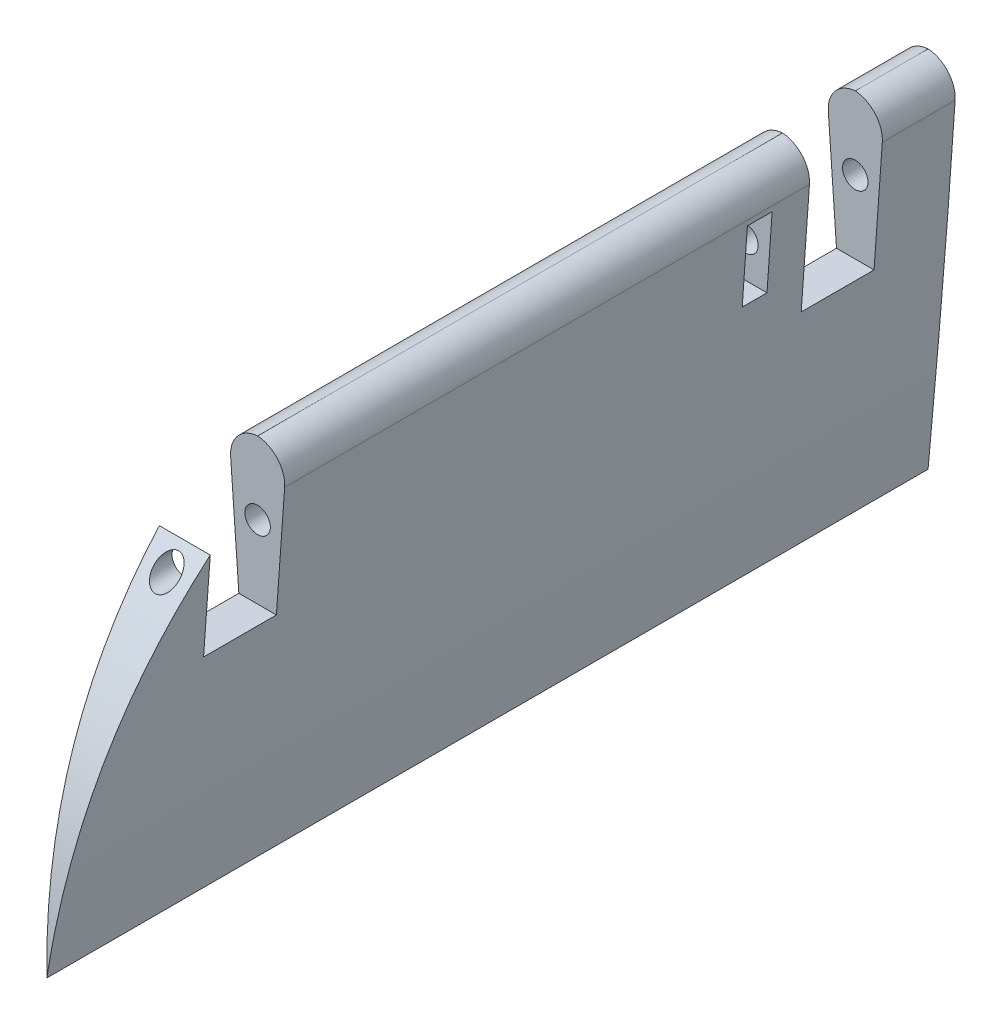
ISO-10303-21;
HEADER;
FILE_DESCRIPTION(('STEP AP214'),'2;1');
FILE_NAME('part.step','',(''),(''),'','','');
FILE_SCHEMA(('AUTOMOTIVE_DESIGN { 1 0 10303 214 1 1 1 1 }'));
ENDSEC;
DATA;
#1=APPLICATION_CONTEXT('core data for automotive mechanical design processes');
#2=APPLICATION_PROTOCOL_DEFINITION('international standard','automotive_design',2000,#1);
#3=PRODUCT_CONTEXT('',#1,'mechanical');
#4=PRODUCT('Part','Part','',(#3));
#5=PRODUCT_RELATED_PRODUCT_CATEGORY('part','',(#4));
#6=PRODUCT_DEFINITION_FORMATION('','',#4);
#7=PRODUCT_DEFINITION_CONTEXT('part definition',#1,'design');
#8=PRODUCT_DEFINITION('design','',#6,#7);
#9=PRODUCT_DEFINITION_SHAPE('','',#8);
#10=(LENGTH_UNIT() NAMED_UNIT(*) SI_UNIT(.MILLI.,.METRE.));
#11=(NAMED_UNIT(*) PLANE_ANGLE_UNIT() SI_UNIT($,.RADIAN.));
#12=(NAMED_UNIT(*) SI_UNIT($,.STERADIAN.) SOLID_ANGLE_UNIT());
#13=UNCERTAINTY_MEASURE_WITH_UNIT(LENGTH_MEASURE(1.E-05),#10,'distance_accuracy_value','');
#14=(GEOMETRIC_REPRESENTATION_CONTEXT(3) GLOBAL_UNCERTAINTY_ASSIGNED_CONTEXT((#13)) GLOBAL_UNIT_ASSIGNED_CONTEXT((#10,
#11,#12)) REPRESENTATION_CONTEXT('',''));
#15=CARTESIAN_POINT('',(0.,0.,0.));
#16=DIRECTION('',(0.,0.,1.));
#17=DIRECTION('',(1.,0.,0.));
#18=AXIS2_PLACEMENT_3D('',#15,#16,#17);
#19=CARTESIAN_POINT('',(0.,-55.,137.120066952089));
#20=DIRECTION('',(0.,0.,-1.));
#21=DIRECTION('',(0.,1.,0.));
#22=AXIS2_PLACEMENT_3D('',#19,#20,#21);
#23=CYLINDRICAL_SURFACE('',#22,1.75);
#24=CARTESIAN_POINT('',(0.,-55.,40.48));
#25=DIRECTION('',(0.,0.,1.));
#26=DIRECTION('',(1.,0.,0.));
#27=AXIS2_PLACEMENT_3D('',#24,#25,#26);
#28=CIRCLE('',#27,1.75);
#29=CARTESIAN_POINT('',(1.75,-55.,40.48));
#30=VERTEX_POINT('',#29);
#31=EDGE_CURVE('E176',#30,#30,#28,.F.);
#32=ORIENTED_EDGE('',*,*,#31,.T.);
#33=EDGE_LOOP('',(#32));
#34=FACE_BOUND('',#33,.T.);
#35=CARTESIAN_POINT('',(0.,-55.,104.062447801836));
#36=DIRECTION('',(0.,0.,-1.));
#37=DIRECTION('',(-1.,0.,0.));
#38=AXIS2_PLACEMENT_3D('',#35,#36,#37);
#39=CIRCLE('',#38,1.75);
#40=CARTESIAN_POINT('',(-1.75,-55.,104.062447801836));
#41=VERTEX_POINT('',#40);
#42=EDGE_CURVE('E245',#41,#41,#39,.F.);
#43=ORIENTED_EDGE('',*,*,#42,.T.);
#44=EDGE_LOOP('',(#43));
#45=FACE_BOUND('',#44,.T.);
#46=ADVANCED_FACE('F38',(#34,#45),#23,.F.);
#47=CARTESIAN_POINT('',(0.,-55.,22.));
#48=DIRECTION('',(0.,0.,-1.));
#49=DIRECTION('',(0.,1.,0.));
#50=AXIS2_PLACEMENT_3D('',#47,#48,#49);
#51=CIRCLE('',#50,1.75);
#52=CARTESIAN_POINT('',(0.,-53.25,22.));
#53=VERTEX_POINT('',#52);
#54=EDGE_CURVE('E295',#53,#53,#51,.F.);
#55=ORIENTED_EDGE('',*,*,#54,.T.);
#56=EDGE_LOOP('',(#55));
#57=FACE_BOUND('',#56,.T.);
#58=CARTESIAN_POINT('',(0.,-55.,12.));
#59=DIRECTION('',(0.,0.,-1.));
#60=DIRECTION('',(0.,1.,0.));
#61=AXIS2_PLACEMENT_3D('',#58,#59,#60);
#62=CIRCLE('',#61,1.75);
#63=CARTESIAN_POINT('',(0.,-53.25,12.));
#64=VERTEX_POINT('',#63);
#65=EDGE_CURVE('E334',#64,#64,#62,.T.);
#66=ORIENTED_EDGE('',*,*,#65,.T.);
#67=EDGE_LOOP('',(#66));
#68=FACE_BOUND('',#67,.T.);
#69=ADVANCED_FACE('F435',(#57,#68),#23,.F.);
#70=CARTESIAN_POINT('',(-0.275771927554584,-49.,58.5240684410084));
#71=DIRECTION('',(0.,0.,-1.));
#72=DIRECTION('',(-1.,0.,0.));
#73=AXIS2_PLACEMENT_3D('',#70,#71,#72);
#74=CYLINDRICAL_SURFACE('',#73,4.);
#75=CARTESIAN_POINT('',(-0.275771927554584,-49.,22.));
#76=DIRECTION('',(0.,0.,-1.));
#77=DIRECTION('',(0.,1.,0.));
#78=AXIS2_PLACEMENT_3D('',#75,#76,#77);
#79=CIRCLE('',#78,4.);
#80=CARTESIAN_POINT('',(3.71553164111286,-49.2636206037898,22.));
#81=VERTEX_POINT('',#80);
#82=CARTESIAN_POINT('',(0.00661221316332859,-45.00998005054,22.));
#83=VERTEX_POINT('',#82);
#84=EDGE_CURVE('E277',#81,#83,#79,.F.);
#85=ORIENTED_EDGE('',*,*,#84,.F.);
#86=DIRECTION('',(0.,0.,-1.));
#87=VECTOR('',#86,1.);
#88=CARTESIAN_POINT('',(3.71553164111332,-49.2636206037829,12.));
#89=LINE('',#88,#87);
#90=CARTESIAN_POINT('',(3.71553164111332,-49.2636206037829,12.));
#91=VERTEX_POINT('',#90);
#92=EDGE_CURVE('E480',#91,#81,#89,.F.);
#93=ORIENTED_EDGE('',*,*,#92,.F.);
#94=CARTESIAN_POINT('',(-0.275771927554584,-49.,12.));
#95=DIRECTION('',(0.,0.,1.));
#96=DIRECTION('',(0.,-1.,0.));
#97=AXIS2_PLACEMENT_3D('',#94,#95,#96);
#98=CIRCLE('',#97,4.);
#99=CARTESIAN_POINT('',(0.00661221314729004,-45.0099800505411,12.));
#100=VERTEX_POINT('',#99);
#101=EDGE_CURVE('E490',#100,#91,#98,.F.);
#102=ORIENTED_EDGE('',*,*,#101,.F.);
#103=DIRECTION('',(0.,0.,-1.));
#104=VECTOR('',#103,1.);
#105=CARTESIAN_POINT('',(0.00661221314729021,-45.0099800505411,61.5915419333976));
#106=LINE('',#105,#104);
#107=EDGE_CURVE('E333',#83,#100,#106,.T.);
#108=ORIENTED_EDGE('',*,*,#107,.F.);
#109=EDGE_LOOP('',(#85,#93,#102,#108));
#110=FACE_BOUND('',#109,.T.);
#111=ADVANCED_FACE('F443',(#110),#74,.T.);
#112=CARTESIAN_POINT('',(0.288996353849457,-49.,58.5240684410084));
#113=DIRECTION('',(0.,0.,-1.));
#114=DIRECTION('',(-1.,0.,0.));
#115=AXIS2_PLACEMENT_3D('',#112,#113,#114);
#116=CYLINDRICAL_SURFACE('',#115,4.);
#117=CARTESIAN_POINT('',(0.288996353849457,-49.,22.));
#118=DIRECTION('',(0.,0.,-1.));
#119=DIRECTION('',(0.,1.,0.));
#120=AXIS2_PLACEMENT_3D('',#117,#118,#119);
#121=CIRCLE('',#120,4.);
#122=CARTESIAN_POINT('',(-3.70247815419465,-49.2610196384069,22.));
#123=VERTEX_POINT('',#122);
#124=EDGE_CURVE('E468',#83,#123,#121,.F.);
#125=ORIENTED_EDGE('',*,*,#124,.F.);
#126=ORIENTED_EDGE('',*,*,#107,.T.);
#127=CARTESIAN_POINT('',(0.288996353849457,-49.,12.));
#128=DIRECTION('',(0.,0.,1.));
#129=DIRECTION('',(0.,-1.,0.));
#130=AXIS2_PLACEMENT_3D('',#127,#128,#129);
#131=CIRCLE('',#130,4.);
#132=CARTESIAN_POINT('',(-3.70247815419465,-49.2610196384069,12.));
#133=VERTEX_POINT('',#132);
#134=EDGE_CURVE('E487',#133,#100,#131,.F.);
#135=ORIENTED_EDGE('',*,*,#134,.F.);
#136=DIRECTION('',(0.,0.,-1.));
#137=VECTOR('',#136,1.);
#138=CARTESIAN_POINT('',(-3.70247815419465,-49.2610196384069,110.588472299358));
#139=LINE('',#138,#137);
#140=EDGE_CURVE('E387',#123,#133,#139,.T.);
#141=ORIENTED_EDGE('',*,*,#140,.F.);
#142=EDGE_LOOP('',(#125,#126,#135,#141));
#143=FACE_BOUND('',#142,.T.);
#144=ADVANCED_FACE('F530',(#143),#116,.T.);
#145=CARTESIAN_POINT('',(-4.88526119402984,10.,150.));
#146=CARTESIAN_POINT('',(-7.,-20.,150.));
#147=CARTESIAN_POINT('',(0.,-95.,150.));
#148=B_SPLINE_CURVE_WITH_KNOTS('',2,(#145,#146,#147),.UNSPECIFIED.,.F.,.F.,(3,3),(0.,1.),.UNSPECIFIED.);
#149=DIRECTION('',(0.,0.,-1.));
#150=VECTOR('',#149,1.);
#151=SURFACE_OF_LINEAR_EXTRUSION('',#148,#150);
#152=DIRECTION('',(0.,0.,-1.));
#153=VECTOR('',#152,1.);
#154=CARTESIAN_POINT('',(-3.65391791044813,-49.9999999999943,72.863));
#155=LINE('',#154,#153);
#156=CARTESIAN_POINT('',(-3.65391791044783,-50.,37.08));
#157=VERTEX_POINT('',#156);
#158=CARTESIAN_POINT('',(-3.65391791044813,-50.,40.48));
#159=VERTEX_POINT('',#158);
#160=EDGE_CURVE('E152',#157,#159,#155,.F.);
#161=ORIENTED_EDGE('',*,*,#160,.T.);
#162=CARTESIAN_POINT('',(-4.88526119402984,10.,40.48));
#163=CARTESIAN_POINT('',(-7.,-20.,40.48));
#164=CARTESIAN_POINT('',(0.,-95.,40.48));
#165=B_SPLINE_CURVE_WITH_KNOTS('',2,(#162,#163,#164),.UNSPECIFIED.,.F.,.F.,(3,3),(0.,1.),.UNSPECIFIED.);
#166=CARTESIAN_POINT('',(-2.95343773233485,-60.,40.48));
#167=VERTEX_POINT('',#166);
#168=EDGE_CURVE('E199',#159,#167,#165,.T.);
#169=ORIENTED_EDGE('',*,*,#168,.T.);
#170=DIRECTION('',(0.,0.,-1.));
#171=VECTOR('',#170,1.);
#172=CARTESIAN_POINT('',(-2.95343773233485,-60.,72.863));
#173=LINE('',#172,#171);
#174=CARTESIAN_POINT('',(-2.95343773233485,-60.,37.08));
#175=VERTEX_POINT('',#174);
#176=EDGE_CURVE('E163',#167,#175,#173,.T.);
#177=ORIENTED_EDGE('',*,*,#176,.T.);
#178=CARTESIAN_POINT('',(-4.88526119402984,10.,37.08));
#179=CARTESIAN_POINT('',(-7.,-20.,37.08));
#180=CARTESIAN_POINT('',(0.,-95.,37.08));
#181=B_SPLINE_CURVE_WITH_KNOTS('',2,(#178,#179,#180),.UNSPECIFIED.,.F.,.F.,(3,3),(0.,1.),.UNSPECIFIED.);
#182=EDGE_CURVE('E167',#175,#157,#181,.F.);
#183=ORIENTED_EDGE('',*,*,#182,.T.);
#184=EDGE_LOOP('',(#161,#169,#177,#183));
#185=FACE_BOUND('',#184,.T.);
#186=DIRECTION('',(0.,0.,-1.));
#187=VECTOR('',#186,1.);
#188=CARTESIAN_POINT('',(-2.5747833014378,-65.00998005054,72.863));
#189=LINE('',#188,#187);
#190=CARTESIAN_POINT('',(-2.57478330195571,-65.00998005054,32.));
#191=VERTEX_POINT('',#190);
#192=CARTESIAN_POINT('',(-2.5747833014378,-65.00998005054,22.));
#193=VERTEX_POINT('',#192);
#194=EDGE_CURVE('E329',#191,#193,#189,.T.);
#195=ORIENTED_EDGE('',*,*,#194,.T.);
#196=CARTESIAN_POINT('',(-4.88526119402984,10.,22.));
#197=CARTESIAN_POINT('',(-7.,-20.,22.));
#198=CARTESIAN_POINT('',(0.,-95.,22.));
#199=B_SPLINE_CURVE_WITH_KNOTS('',2,(#196,#197,#198),.UNSPECIFIED.,.F.,.F.,(3,3),(0.,1.),.UNSPECIFIED.);
#200=EDGE_CURVE('E286',#193,#123,#199,.F.);
#201=ORIENTED_EDGE('',*,*,#200,.T.);
#202=ORIENTED_EDGE('',*,*,#140,.T.);
#203=CARTESIAN_POINT('',(-4.88526119402984,10.,12.));
#204=CARTESIAN_POINT('',(-7.,-20.,12.));
#205=CARTESIAN_POINT('',(0.,-95.,12.));
#206=B_SPLINE_CURVE_WITH_KNOTS('',2,(#203,#204,#205),.UNSPECIFIED.,.F.,.F.,(3,3),(0.,1.),.UNSPECIFIED.);
#207=CARTESIAN_POINT('',(0.,-95.,12.));
#208=VERTEX_POINT('',#207);
#209=EDGE_CURVE('E511',#133,#208,#206,.T.);
#210=ORIENTED_EDGE('',*,*,#209,.T.);
#211=DIRECTION('',(0.,0.,-1.));
#212=VECTOR('',#211,1.);
#213=CARTESIAN_POINT('',(0.,-95.,150.));
#214=LINE('',#213,#212);
#215=CARTESIAN_POINT('',(0.,-95.,133.));
#216=VERTEX_POINT('',#215);
#217=EDGE_CURVE('E507',#216,#208,#214,.T.);
#218=ORIENTED_EDGE('',*,*,#217,.F.);
#219=CARTESIAN_POINT('',(0.,-95.,133.));
#220=CARTESIAN_POINT('',(-0.0584034225727897,-94.3742508216102,132.953702938274));
#221=CARTESIAN_POINT('',(-0.11650636714418,-93.7489683881835,132.900558011341));
#222=CARTESIAN_POINT('',(-0.232083168674797,-92.4995503925808,132.780112658013));
#223=CARTESIAN_POINT('',(-0.289556862241481,-91.8754151617299,132.712808642646));
#224=CARTESIAN_POINT('',(-0.403823044874967,-90.6287607321233,132.563600944772));
#225=CARTESIAN_POINT('',(-0.460615465385538,-90.0062417008629,132.481695805897));
#226=CARTESIAN_POINT('',(-0.573467899404635,-88.7632962282029,132.302856395714));
#227=CARTESIAN_POINT('',(-0.629527913037087,-88.1428697864494,132.20592212695));
#228=CARTESIAN_POINT('',(-0.741026182077854,-86.9028011283669,131.996308126714));
#229=CARTESIAN_POINT('',(-0.796462228293532,-86.2831661032472,131.883584601598));
#230=CARTESIAN_POINT('',(-0.906499459238202,-85.046953679061,131.642202189913));
#231=CARTESIAN_POINT('',(-0.961100674792454,-84.4303761676697,131.513543893322));
#232=CARTESIAN_POINT('',(-1.06942212321582,-83.2007475005484,131.239905905399));
#233=CARTESIAN_POINT('',(-1.12314232673307,-82.5876964627468,131.094925671544));
#234=CARTESIAN_POINT('',(-1.22965658923413,-81.3655980783779,130.78828125882));
#235=CARTESIAN_POINT('',(-1.28245049647298,-80.7565513978325,130.626614375673));
#236=CARTESIAN_POINT('',(-1.40822163555258,-79.2975538010185,130.217431902014));
#237=CARTESIAN_POINT('',(-1.48072019962185,-78.4498616983703,129.961651804522));
#238=CARTESIAN_POINT('',(-1.62364280767818,-76.7652001799127,129.415840467806));
#239=CARTESIAN_POINT('',(-1.69406641050507,-75.928233065429,129.125802009593));
#240=CARTESIAN_POINT('',(-1.83268935460771,-74.2668880828053,128.511013764779));
#241=CARTESIAN_POINT('',(-1.90088857394494,-73.4425109061463,128.186262079392));
#242=CARTESIAN_POINT('',(-2.03492863577877,-71.8081564756131,127.501811111396));
#243=CARTESIAN_POINT('',(-2.10076940221848,-70.9981796865554,127.142110703124));
#244=CARTESIAN_POINT('',(-2.22991563882229,-69.3951085048869,126.388115492584));
#245=CARTESIAN_POINT('',(-2.29322318700014,-68.6020005357309,125.993849928251));
#246=CARTESIAN_POINT('',(-2.41725735906117,-67.0336865796972,125.170768122033));
#247=CARTESIAN_POINT('',(-2.47798393235979,-66.2584809438235,124.741951203453));
#248=CARTESIAN_POINT('',(-2.59676392682587,-64.7276882950721,123.850401630293));
#249=CARTESIAN_POINT('',(-2.65481753754761,-63.9720998926924,123.387671386741));
#250=CARTESIAN_POINT('',(-2.76818393879278,-62.4820888557689,122.429197321561));
#251=CARTESIAN_POINT('',(-2.82349710924275,-61.7476632932117,121.933458098663));
#252=CARTESIAN_POINT('',(-2.9239639051309,-60.4002620089743,120.980124963114));
#253=CARTESIAN_POINT('',(-2.9694715872808,-59.7844261523127,120.526602396967));
#254=CARTESIAN_POINT('',(-3.05841272929596,-58.5701231375662,119.596588867895));
#255=CARTESIAN_POINT('',(-3.10184604552841,-57.971657183327,119.120096319066));
#256=CARTESIAN_POINT('',(-3.1866445182611,-56.7926434017922,118.145040837321));
#257=CARTESIAN_POINT('',(-3.22800926841692,-56.2120991034908,117.646473604087));
#258=CARTESIAN_POINT('',(-3.30868731034548,-55.0693804442162,116.628263626139));
#259=CARTESIAN_POINT('',(-3.34800005560911,-54.507210991755,116.10861533175));
#260=CARTESIAN_POINT('',(-3.42459948984835,-53.4016130302037,115.049337275581));
#261=CARTESIAN_POINT('',(-3.46188565432027,-52.8581893859255,114.509702401222));
#262=CARTESIAN_POINT('',(-3.53467289863078,-51.7873206696567,113.408498054647));
#263=CARTESIAN_POINT('',(-3.57016220636822,-51.2599882059896,112.84681835812));
#264=CARTESIAN_POINT('',(-3.63916661543019,-50.2247921782294,111.705745479416));
#265=CARTESIAN_POINT('',(-3.67268182222155,-49.7169275745683,111.126353246052));
#266=CARTESIAN_POINT('',(-3.73778828165493,-48.7207720058672,109.951190442909));
#267=CARTESIAN_POINT('',(-3.76938012021383,-48.2324750955579,109.35542494201));
#268=CARTESIAN_POINT('',(-3.83069540845114,-47.2754911316255,108.148915460273));
#269=CARTESIAN_POINT('',(-3.86042008565838,-46.8067912635493,107.538181695132));
#270=CARTESIAN_POINT('',(-3.91806224732619,-45.8889483168715,106.303180615203));
#271=CARTESIAN_POINT('',(-3.94598174567213,-45.4397836343298,105.678929456449));
#272=CARTESIAN_POINT('',(-3.97305146955679,-45.,105.048136882017));
#273=B_SPLINE_CURVE_WITH_KNOTS('',3,(#219,#220,#221,#222,#223,#224,#225,#226,#227,#228,#229,
#230,#231,#232,#233,#234,#235,#236,#237,#238,#239,#240,#241,#242,#243,#244,#245,#246,#247,#248,
#249,#250,#251,#252,#253,#254,#255,#256,#257,#258,#259,#260,#261,#262,#263,#264,#265,#266,#267,
#268,#269,#270,#271,#272),.UNSPECIFIED.,.F.,.F.,(4,2,2,2,2,2,2,2,2,2,2,2,2,2,2,2,2,2,2,2,2,2,2,
2,2,2,4),(0.,1.89049516687578,3.78147010536888,5.6726337620168,7.56379709866848,
9.46031371201132,11.3567601284926,13.2532695992714,15.1500869069672,17.8145598716902,
20.4795953044103,23.1447765870529,25.8100437409359,28.4730777617295,31.1361639513234,
33.7990609952506,36.4615878239997,38.759546849676,41.0576647601593,43.3562323485493,
45.6554090216497,47.9551779434273,50.2684557045544,52.5816097659249,54.8940556070211,
57.2049649112741,59.5132499869656),.UNSPECIFIED.);
#274=CARTESIAN_POINT('',(-3.49142966304688,-52.4234696262604,114.062447801836));
#275=VERTEX_POINT('',#274);
#276=EDGE_CURVE('E344',#216,#275,#273,.T.);
#277=ORIENTED_EDGE('',*,*,#276,.T.);
#278=CARTESIAN_POINT('',(-4.88526119402984,10.,114.062447801836));
#279=CARTESIAN_POINT('',(-7.,-20.,114.062447801836));
#280=CARTESIAN_POINT('',(0.,-95.,114.062447801836));
#281=B_SPLINE_CURVE_WITH_KNOTS('',2,(#278,#279,#280),.UNSPECIFIED.,.F.,.F.,(3,3),(0.,1.),.UNSPECIFIED.);
#282=CARTESIAN_POINT('',(-2.57478330195572,-65.0099800505399,114.062447801836));
#283=VERTEX_POINT('',#282);
#284=EDGE_CURVE('E313',#275,#283,#281,.T.);
#285=ORIENTED_EDGE('',*,*,#284,.T.);
#286=DIRECTION('',(0.,0.,-1.));
#287=VECTOR('',#286,1.);
#288=CARTESIAN_POINT('',(-2.5747833014378,-65.0099800505399,72.863));
#289=LINE('',#288,#287);
#290=CARTESIAN_POINT('',(-2.5747833014378,-65.0099800505399,104.062447801836));
#291=VERTEX_POINT('',#290);
#292=EDGE_CURVE('E322',#283,#291,#289,.T.);
#293=ORIENTED_EDGE('',*,*,#292,.T.);
#294=CARTESIAN_POINT('',(-4.88526119402984,10.,104.062447801836));
#295=CARTESIAN_POINT('',(-7.,-20.,104.062447801836));
#296=CARTESIAN_POINT('',(0.,-95.,104.062447801836));
#297=B_SPLINE_CURVE_WITH_KNOTS('',2,(#294,#295,#296),.UNSPECIFIED.,.F.,.F.,(3,3),(0.,1.),.UNSPECIFIED.);
#298=CARTESIAN_POINT('',(-3.70247815419465,-49.2610196384069,104.062447801836));
#299=VERTEX_POINT('',#298);
#300=EDGE_CURVE('E236',#291,#299,#297,.F.);
#301=ORIENTED_EDGE('',*,*,#300,.T.);
#302=CARTESIAN_POINT('',(-3.70247815419465,-49.2610196384069,32.));
#303=VERTEX_POINT('',#302);
#304=EDGE_CURVE('E492',#299,#303,#139,.T.);
#305=ORIENTED_EDGE('',*,*,#304,.T.);
#306=CARTESIAN_POINT('',(-4.88526119402984,10.,32.));
#307=CARTESIAN_POINT('',(-7.,-20.,32.));
#308=CARTESIAN_POINT('',(0.,-95.,32.));
#309=B_SPLINE_CURVE_WITH_KNOTS('',2,(#306,#307,#308),.UNSPECIFIED.,.F.,.F.,(3,3),(0.,1.),.UNSPECIFIED.);
#310=EDGE_CURVE('E261',#303,#191,#309,.T.);
#311=ORIENTED_EDGE('',*,*,#310,.T.);
#312=EDGE_LOOP('',(#195,#201,#202,#210,#218,#277,#285,#293,#301,#305,#311));
#313=FACE_BOUND('',#312,.T.);
#314=ADVANCED_FACE('F173',(#185,#313),#151,.F.);
#315=CARTESIAN_POINT('',(0.,-95.,150.));
#316=CARTESIAN_POINT('',(7.00000000000001,-20.,150.));
#317=CARTESIAN_POINT('',(5.,10.,150.));
#318=B_SPLINE_CURVE_WITH_KNOTS('',2,(#315,#316,#317),.UNSPECIFIED.,.F.,.F.,(3,3),(0.,1.),.UNSPECIFIED.);
#319=DIRECTION('',(0.,0.,-1.));
#320=VECTOR('',#319,1.);
#321=SURFACE_OF_LINEAR_EXTRUSION('',#318,#320);
#322=DIRECTION('',(0.,0.,-1.));
#323=VECTOR('',#322,1.);
#324=CARTESIAN_POINT('',(2.96075033130286,-60.,72.863));
#325=LINE('',#324,#323);
#326=CARTESIAN_POINT('',(2.96075033130286,-60.,37.08));
#327=VERTEX_POINT('',#326);
#328=CARTESIAN_POINT('',(2.96075033130286,-60.,40.48));
#329=VERTEX_POINT('',#328);
#330=EDGE_CURVE('E47',#327,#329,#325,.F.);
#331=ORIENTED_EDGE('',*,*,#330,.T.);
#332=CARTESIAN_POINT('',(0.,-95.,40.48));
#333=CARTESIAN_POINT('',(7.00000000000001,-20.,40.48));
#334=CARTESIAN_POINT('',(5.,10.,40.48));
#335=B_SPLINE_CURVE_WITH_KNOTS('',2,(#332,#333,#334),.UNSPECIFIED.,.F.,.F.,(3,3),(0.,1.),.UNSPECIFIED.);
#336=CARTESIAN_POINT('',(3.66666666666667,-50.,40.48));
#337=VERTEX_POINT('',#336);
#338=EDGE_CURVE('E181',#329,#337,#335,.T.);
#339=ORIENTED_EDGE('',*,*,#338,.T.);
#340=DIRECTION('',(0.,0.,-1.));
#341=VECTOR('',#340,1.);
#342=CARTESIAN_POINT('',(3.66666666666667,-50.,72.863));
#343=LINE('',#342,#341);
#344=CARTESIAN_POINT('',(3.66666666666675,-50.,37.08));
#345=VERTEX_POINT('',#344);
#346=EDGE_CURVE('E11',#337,#345,#343,.T.);
#347=ORIENTED_EDGE('',*,*,#346,.T.);
#348=CARTESIAN_POINT('',(0.,-95.,37.08));
#349=CARTESIAN_POINT('',(7.00000000000001,-20.,37.08));
#350=CARTESIAN_POINT('',(5.,10.,37.08));
#351=B_SPLINE_CURVE_WITH_KNOTS('',2,(#348,#349,#350),.UNSPECIFIED.,.F.,.F.,(3,3),(0.,1.),.UNSPECIFIED.);
#352=EDGE_CURVE('E170',#345,#327,#351,.F.);
#353=ORIENTED_EDGE('',*,*,#352,.T.);
#354=EDGE_LOOP('',(#331,#339,#347,#353));
#355=FACE_BOUND('',#354,.T.);
#356=ORIENTED_EDGE('',*,*,#92,.T.);
#357=CARTESIAN_POINT('',(0.,-95.,22.));
#358=CARTESIAN_POINT('',(7.00000000000001,-20.,22.));
#359=CARTESIAN_POINT('',(5.,10.,22.));
#360=B_SPLINE_CURVE_WITH_KNOTS('',2,(#357,#358,#359),.UNSPECIFIED.,.F.,.F.,(3,3),(0.,1.),.UNSPECIFIED.);
#361=CARTESIAN_POINT('',(2.5800194330369,-65.00998005054,22.));
#362=VERTEX_POINT('',#361);
#363=EDGE_CURVE('E280',#81,#362,#360,.F.);
#364=ORIENTED_EDGE('',*,*,#363,.T.);
#365=DIRECTION('',(0.,0.,-1.));
#366=VECTOR('',#365,1.);
#367=CARTESIAN_POINT('',(2.5800194330369,-65.00998005054,72.863));
#368=LINE('',#367,#366);
#369=CARTESIAN_POINT('',(2.58001943355733,-65.00998005054,32.));
#370=VERTEX_POINT('',#369);
#371=EDGE_CURVE('E456',#362,#370,#368,.F.);
#372=ORIENTED_EDGE('',*,*,#371,.T.);
#373=CARTESIAN_POINT('',(0.,-95.,32.));
#374=CARTESIAN_POINT('',(7.00000000000001,-20.,32.));
#375=CARTESIAN_POINT('',(5.,10.,32.));
#376=B_SPLINE_CURVE_WITH_KNOTS('',2,(#373,#374,#375),.UNSPECIFIED.,.F.,.F.,(3,3),(0.,1.),.UNSPECIFIED.);
#377=CARTESIAN_POINT('',(3.71553164111286,-49.2636206037898,32.));
#378=VERTEX_POINT('',#377);
#379=EDGE_CURVE('E255',#370,#378,#376,.T.);
#380=ORIENTED_EDGE('',*,*,#379,.T.);
#381=CARTESIAN_POINT('',(3.71553164111286,-49.2636206037898,104.062447801836));
#382=VERTEX_POINT('',#381);
#383=EDGE_CURVE('E486',#378,#382,#89,.F.);
#384=ORIENTED_EDGE('',*,*,#383,.T.);
#385=CARTESIAN_POINT('',(0.,-95.,104.062447801836));
#386=CARTESIAN_POINT('',(7.00000000000001,-20.,104.062447801836));
#387=CARTESIAN_POINT('',(5.,10.,104.062447801836));
#388=B_SPLINE_CURVE_WITH_KNOTS('',2,(#385,#386,#387),.UNSPECIFIED.,.F.,.F.,(3,3),(0.,1.),.UNSPECIFIED.);
#389=CARTESIAN_POINT('',(2.5800194330369,-65.0099800505399,104.062447801836));
#390=VERTEX_POINT('',#389);
#391=EDGE_CURVE('E230',#382,#390,#388,.F.);
#392=ORIENTED_EDGE('',*,*,#391,.T.);
#393=DIRECTION('',(0.,0.,-1.));
#394=VECTOR('',#393,1.);
#395=CARTESIAN_POINT('',(2.58001943303691,-65.0099800505399,72.863));
#396=LINE('',#395,#394);
#397=CARTESIAN_POINT('',(2.58001943355734,-65.0099800505399,114.062447801836));
#398=VERTEX_POINT('',#397);
#399=EDGE_CURVE('E459',#390,#398,#396,.F.);
#400=ORIENTED_EDGE('',*,*,#399,.T.);
#401=CARTESIAN_POINT('',(0.,-95.,114.062447801836));
#402=CARTESIAN_POINT('',(7.00000000000001,-20.,114.062447801836));
#403=CARTESIAN_POINT('',(5.,10.,114.062447801836));
#404=B_SPLINE_CURVE_WITH_KNOTS('',2,(#401,#402,#403),.UNSPECIFIED.,.F.,.F.,(3,3),(0.,1.),.UNSPECIFIED.);
#405=CARTESIAN_POINT('',(3.50269123540687,-52.4234696262604,114.062447801836));
#406=VERTEX_POINT('',#405);
#407=EDGE_CURVE('E307',#398,#406,#404,.T.);
#408=ORIENTED_EDGE('',*,*,#407,.T.);
#409=CARTESIAN_POINT('',(3.98924451310623,-45.,105.048136882017));
#410=CARTESIAN_POINT('',(3.96677867507539,-45.3606411175344,105.5654083278));
#411=CARTESIAN_POINT('',(3.94374135217259,-45.7275838607339,106.078277462778));
#412=CARTESIAN_POINT('',(3.89647850826135,-46.4743084917053,107.094732858927));
#413=CARTESIAN_POINT('',(3.87225267503291,-46.8540937449563,107.598316632525));
#414=CARTESIAN_POINT('',(3.82257683775809,-47.6265889021296,108.595500760636));
#415=CARTESIAN_POINT('',(3.79712670727741,-48.0193001396022,109.089100076534));
#416=CARTESIAN_POINT('',(3.74496819158907,-48.8176991866289,110.065627927242));
#417=CARTESIAN_POINT('',(3.7182598043245,-49.2233870173962,110.548556444606));
#418=CARTESIAN_POINT('',(3.66346838592755,-50.0490320678072,111.504540833469));
#419=CARTESIAN_POINT('',(3.63538144287886,-50.4690287207412,111.97756244203));
#420=CARTESIAN_POINT('',(3.5778785108598,-51.3221022301096,112.911544417126));
#421=CARTESIAN_POINT('',(3.54846257894617,-51.7551785247388,113.372505300119));
#422=CARTESIAN_POINT('',(3.48827311943495,-52.634384742633,114.281743440853));
#423=CARTESIAN_POINT('',(3.45749956051311,-53.0805149670086,114.730020405549));
#424=CARTESIAN_POINT('',(3.39456960273978,-53.9857626076266,115.613288673891));
#425=CARTESIAN_POINT('',(3.36241300672224,-54.4448818723753,116.04827806804));
#426=CARTESIAN_POINT('',(3.28505847938812,-55.5408735815255,117.055973384903));
#427=CARTESIAN_POINT('',(3.23927736971892,-56.1830793474648,117.622854752628));
#428=CARTESIAN_POINT('',(3.14511820851761,-57.4904288914762,118.729577926907));
#429=CARTESIAN_POINT('',(3.09673960276595,-58.1555775538899,119.269413914994));
#430=CARTESIAN_POINT('',(2.99738521113455,-59.507922689517,120.32058188728));
#431=CARTESIAN_POINT('',(2.94640925933882,-60.1951205701728,120.831912046174));
#432=CARTESIAN_POINT('',(2.84188015101405,-61.5904968148254,121.82479675028));
#433=CARTESIAN_POINT('',(2.78832703666337,-62.2986748353842,122.306351782505));
#434=CARTESIAN_POINT('',(2.67874177644291,-63.7340243595879,123.238141755949));
#435=CARTESIAN_POINT('',(2.62271248188552,-64.4611736418523,123.688411260264));
#436=CARTESIAN_POINT('',(2.50817680391545,-65.9338855094944,124.557413383229));
#437=CARTESIAN_POINT('',(2.4496704231557,-66.6794480751514,124.976146035653));
#438=CARTESIAN_POINT('',(2.33025814827484,-68.1875107405097,125.781495987683));
#439=CARTESIAN_POINT('',(2.26935229849981,-68.9500105270703,126.168113880413));
#440=CARTESIAN_POINT('',(2.14523813128456,-70.490349949444,126.90888743784));
#441=CARTESIAN_POINT('',(2.08203000346646,-71.2681883195187,127.263045767588));
#442=CARTESIAN_POINT('',(1.95353194389817,-72.836219921915,127.938231273561));
#443=CARTESIAN_POINT('',(1.88824608013747,-73.626387633469,128.259318534742));
#444=CARTESIAN_POINT('',(1.75559186393366,-75.2189554148672,128.869290424828));
#445=CARTESIAN_POINT('',(1.68822331700726,-76.0213566235217,129.158172034661));
#446=CARTESIAN_POINT('',(1.55153086922689,-77.6367671816213,129.704072026495));
#447=CARTESIAN_POINT('',(1.48220694769086,-78.4497766432213,129.96109007132));
#448=CARTESIAN_POINT('',(1.34172978787296,-80.0849008937834,130.443836564247));
#449=CARTESIAN_POINT('',(1.27057639925091,-80.9070164278755,130.669562431045));
#450=CARTESIAN_POINT('',(1.05455352376865,-83.3849507178839,131.300866136859));
#451=CARTESIAN_POINT('',(0.907117349818232,-85.0524041629309,131.660585831156));
#452=CARTESIAN_POINT('',(0.606502683391491,-88.406760773301,132.264710873733));
#453=CARTESIAN_POINT('',(0.453325990161285,-90.0936577315564,132.509152032719));
#454=CARTESIAN_POINT('',(0.248546538397762,-92.3211000175993,132.76074555412));
#455=CARTESIAN_POINT('',(0.19911023234439,-92.8567574413308,132.815859622704));
#456=CARTESIAN_POINT('',(0.0998552354703662,-93.9281510391163,132.915645035655));
#457=CARTESIAN_POINT('',(0.0500372699899054,-94.4638857588921,132.960332699208));
#458=CARTESIAN_POINT('',(0.,-95.,133.));
#459=B_SPLINE_CURVE_WITH_KNOTS('',3,(#409,#410,#411,#412,#413,#414,#415,#416,#417,#418,#419,
#420,#421,#422,#423,#424,#425,#426,#427,#428,#429,#430,#431,#432,#433,#434,#435,#436,#437,#438,
#439,#440,#441,#442,#443,#444,#445,#446,#447,#448,#449,#450,#451,#452,#453,#454,#455,#456,#457,
#458),.UNSPECIFIED.,.F.,.F.,(4,2,2,2,2,2,2,2,2,2,2,2,2,2,2,2,2,2,2,2,2,2,2,2,4),(0.,
1.89291404579642,3.78632804834859,5.67993800705596,7.57355106143386,9.47288919999539,
11.3721458726664,13.2714463894401,15.1710185742408,17.743764658752,20.3170618805021,
22.8905236886258,25.4639433932694,28.0344733232072,30.6050005002255,33.175480192008,
35.7457486484333,38.311261750381,40.8770151508088,43.4427956994784,46.0087877745853,
51.1406231176837,56.2708632297781,57.8930462441142,59.5126729599817),.UNSPECIFIED.);
#460=EDGE_CURVE('E370',#406,#216,#459,.T.);
#461=ORIENTED_EDGE('',*,*,#460,.T.);
#462=ORIENTED_EDGE('',*,*,#217,.T.);
#463=CARTESIAN_POINT('',(0.,-95.,12.));
#464=CARTESIAN_POINT('',(7.00000000000001,-20.,12.));
#465=CARTESIAN_POINT('',(5.,10.,12.));
#466=B_SPLINE_CURVE_WITH_KNOTS('',2,(#463,#464,#465),.UNSPECIFIED.,.F.,.F.,(3,3),(0.,1.),.UNSPECIFIED.);
#467=EDGE_CURVE('E384',#208,#91,#466,.T.);
#468=ORIENTED_EDGE('',*,*,#467,.T.);
#469=EDGE_LOOP('',(#356,#364,#372,#380,#384,#392,#400,#408,#461,#462,#468));
#470=FACE_BOUND('',#469,.T.);
#471=ADVANCED_FACE('F364',(#355,#470),#321,.F.);
#472=CARTESIAN_POINT('',(-15.4489835845633,-95.,12.));
#473=DIRECTION('',(0.,0.,1.));
#474=DIRECTION('',(0.,-1.,0.));
#475=AXIS2_PLACEMENT_3D('',#472,#473,#474);
#476=PLANE('',#475);
#477=ORIENTED_EDGE('',*,*,#65,.F.);
#478=EDGE_LOOP('',(#477));
#479=FACE_BOUND('',#478,.T.);
#480=ORIENTED_EDGE('',*,*,#209,.F.);
#481=ORIENTED_EDGE('',*,*,#134,.T.);
#482=ORIENTED_EDGE('',*,*,#101,.T.);
#483=ORIENTED_EDGE('',*,*,#467,.F.);
#484=EDGE_LOOP('',(#480,#481,#482,#483));
#485=FACE_BOUND('',#484,.T.);
#486=ADVANCED_FACE('F361',(#479,#485),#476,.F.);
#487=CARTESIAN_POINT('',(-15.4489835845633,-95.,133.));
#488=CARTESIAN_POINT('',(-15.4489835845633,-62.8286696312048,130.619727744215));
#489=CARTESIAN_POINT('',(-15.4489835845633,-45.,105.048136882017));
#490=B_SPLINE_CURVE_WITH_KNOTS('',2,(#487,#488,#489),.UNSPECIFIED.,.F.,.F.,(3,3),(0.,1.),.UNSPECIFIED.);
#491=DIRECTION('',(1.,0.,0.));
#492=VECTOR('',#491,1.);
#493=SURFACE_OF_LINEAR_EXTRUSION('',#490,#492);
#494=CARTESIAN_POINT('',(0.,-53.25,114.893690283348));
#495=CARTESIAN_POINT('',(0.0392409078147903,-53.2500008991303,114.893691194577));
#496=CARTESIAN_POINT('',(0.0784923559162467,-53.2513240516612,114.89499826745));
#497=CARTESIAN_POINT('',(0.156656408412269,-53.2565841589712,114.900193034924));
#498=CARTESIAN_POINT('',(0.195568777318472,-53.2605228031563,114.904082397485));
#499=CARTESIAN_POINT('',(0.311466805378817,-53.2761813812298,114.919539016349));
#500=CARTESIAN_POINT('',(0.387487465899817,-53.2917436182019,114.934894446629));
#501=CARTESIAN_POINT('',(0.534000836736646,-53.3317405325027,114.974295604868));
#502=CARTESIAN_POINT('',(0.60453080530204,-53.3561076358974,114.998275139755));
#503=CARTESIAN_POINT('',(0.73950001136917,-53.4122393561857,115.053398309283));
#504=CARTESIAN_POINT('',(0.803939576717817,-53.4440035745728,115.084541557991));
#505=CARTESIAN_POINT('',(0.951356016297492,-53.5278326022716,115.166527186571));
#506=CARTESIAN_POINT('',(1.03105719733632,-53.5828737349435,115.22020356005));
#507=CARTESIAN_POINT('',(1.17719211495577,-53.7016824452826,115.335581690975));
#508=CARTESIAN_POINT('',(1.24358891382584,-53.7654735119126,115.397305027405));
#509=CARTESIAN_POINT('',(1.34429169189783,-53.8778977408066,115.505589469156));
#510=CARTESIAN_POINT('',(1.38207772943286,-53.9248740647519,115.550705570431));
#511=CARTESIAN_POINT('',(1.45180277563141,-54.0210759620534,115.642803484495));
#512=CARTESIAN_POINT('',(1.48375061969437,-54.0702979933181,115.689782344858));
#513=CARTESIAN_POINT('',(1.57127664234335,-54.2208446790215,115.832990627114));
#514=CARTESIAN_POINT('',(1.61849525500699,-54.3250015090697,115.931445041878));
#515=CARTESIAN_POINT('',(1.6924325878645,-54.5402017694549,116.133432070214));
#516=CARTESIAN_POINT('',(1.71866265586613,-54.6513477565853,116.237029198535));
#517=CARTESIAN_POINT('',(1.74928517136707,-54.8760658908135,116.444952259535));
#518=CARTESIAN_POINT('',(1.7536627517571,-54.9896396368678,116.549278640043));
#519=CARTESIAN_POINT('',(1.73910904097188,-55.2360086851337,116.773928561552));
#520=CARTESIAN_POINT('',(1.71613511877036,-55.3688252651223,116.893992664569));
#521=CARTESIAN_POINT('',(1.6382474834144,-55.6302330243503,117.128330656257));
#522=CARTESIAN_POINT('',(1.58337811716759,-55.7588298089799,117.242612345358));
#523=CARTESIAN_POINT('',(1.46336475673859,-55.9644312819642,117.423928329068));
#524=CARTESIAN_POINT('',(1.40774837714724,-56.0443403271235,117.49400999439));
#525=CARTESIAN_POINT('',(1.280510031767,-56.1969242292038,117.627198542708));
#526=CARTESIAN_POINT('',(1.20891377610538,-56.2696104384973,117.690316388767));
#527=CARTESIAN_POINT('',(1.06591002152707,-56.3903965333157,117.794778724856));
#528=CARTESIAN_POINT('',(0.997502767492111,-56.4404765303778,117.83792993166));
#529=CARTESIAN_POINT('',(0.850828003637819,-56.5316730973139,117.916298684666));
#530=CARTESIAN_POINT('',(0.772571127680169,-56.5727992052041,117.951524674453));
#531=CARTESIAN_POINT('',(0.620218515858189,-56.6381706926417,118.007408338425));
#532=CARTESIAN_POINT('',(0.547340839992119,-56.6640409766245,118.029474659962));
#533=CARTESIAN_POINT('',(0.396909289467557,-56.7061803373285,118.065379603794));
#534=CARTESIAN_POINT('',(0.319357893796581,-56.7224544554018,118.079222546275));
#535=CARTESIAN_POINT('',(0.16137410163465,-56.7443736073639,118.097860344183));
#536=CARTESIAN_POINT('',(0.0809319329062164,-56.7499782769779,118.10262083937));
#537=CARTESIAN_POINT('',(-0.0799567167106913,-56.7500215872106,118.102657656655));
#538=CARTESIAN_POINT('',(-0.160403196807447,-56.7444610759838,118.097934699155));
#539=CARTESIAN_POINT('',(-0.313671747984531,-56.7232870976037,118.079930555265));
#540=CARTESIAN_POINT('',(-0.386654034991317,-56.7083325524601,118.06721027559));
#541=CARTESIAN_POINT('',(-0.528585003582571,-56.6698825832689,118.03445453184));
#542=CARTESIAN_POINT('',(-0.597533167913351,-56.6463860667468,118.014418132069));
#543=CARTESIAN_POINT('',(-0.734425769647655,-56.5902645336151,117.966464547497));
#544=CARTESIAN_POINT('',(-0.802016881363003,-56.5571474080101,117.938121477265));
#545=CARTESIAN_POINT('',(-0.930325301222134,-56.4840679041177,117.875414211612));
#546=CARTESIAN_POINT('',(-0.991038419655513,-56.4441013903916,117.841046378346));
#547=CARTESIAN_POINT('',(-1.13193912106677,-56.338716704076,117.750155326758));
#548=CARTESIAN_POINT('',(-1.20794271611723,-56.2701409112174,117.690790877722));
#549=CARTESIAN_POINT('',(-1.34432640976994,-56.1248376846751,117.564373651867));
#550=CARTESIAN_POINT('',(-1.40466702399816,-56.0480903245883,117.497302048068));
#551=CARTESIAN_POINT('',(-1.49180068254971,-55.9169992505154,117.382126200967));
#552=CARTESIAN_POINT('',(-1.52296171892949,-55.8641500740884,117.335540912008));
#553=CARTESIAN_POINT('',(-1.57901612422897,-55.7568784479325,117.240650612586));
#554=CARTESIAN_POINT('',(-1.60391868119305,-55.7024584368502,117.192348243382));
#555=CARTESIAN_POINT('',(-1.66965889926861,-55.5373833669399,117.045299786143));
#556=CARTESIAN_POINT('',(-1.70151008385638,-55.4249428229514,116.944438280186));
#557=CARTESIAN_POINT('',(-1.7428296855154,-55.1967705349439,116.738236627228));
#558=CARTESIAN_POINT('',(-1.75191733722497,-55.0810151493491,116.632849907271));
#559=CARTESIAN_POINT('',(-1.7474116033379,-54.8504502812914,116.421364609723));
#560=CARTESIAN_POINT('',(-1.73379512514289,-54.7356418813996,116.315265416811));
#561=CARTESIAN_POINT('',(-1.68004467706656,-54.4923478737868,116.088779261399));
#562=CARTESIAN_POINT('',(-1.63624021753576,-54.364393167426,115.96863576851));
#563=CARTESIAN_POINT('',(-1.54714171207118,-54.1793125174363,115.793491132543));
#564=CARTESIAN_POINT('',(-1.51355412805245,-54.1187741837235,115.735967507068));
#565=CARTESIAN_POINT('',(-1.43828696811975,-54.0006317237291,115.62328722601));
#566=CARTESIAN_POINT('',(-1.39661199739696,-53.9430259510172,115.568129245084));
#567=CARTESIAN_POINT('',(-1.29477805094452,-53.8194162189817,115.44935337065));
#568=CARTESIAN_POINT('',(-1.2325702498448,-53.7543127101772,115.386506575051));
#569=CARTESIAN_POINT('',(-1.1295761739899,-53.6625902596102,115.29762928393));
#570=CARTESIAN_POINT('',(-1.09366347955049,-53.6330260682026,115.268923025735));
#571=CARTESIAN_POINT('',(-1.01849695513606,-53.5761356516247,115.213585358377));
#572=CARTESIAN_POINT('',(-0.97923857865349,-53.5488125741067,115.186956869921));
#573=CARTESIAN_POINT('',(-0.87390449112355,-53.481906056985,115.121645680484));
#574=CARTESIAN_POINT('',(-0.805371047260546,-53.4442882261294,115.08481804421));
#575=CARTESIAN_POINT('',(-0.660752515411915,-53.3775862629327,115.019390660829));
#576=CARTESIAN_POINT('',(-0.584683415246645,-53.348484560462,114.990773975637));
#577=CARTESIAN_POINT('',(-0.438189396468028,-53.3042941694207,114.947265676389));
#578=CARTESIAN_POINT('',(-0.368635970339842,-53.2877563057138,114.93095722));
#579=CARTESIAN_POINT('',(-0.262260133943437,-53.2693878118772,114.912833467888));
#580=CARTESIAN_POINT('',(-0.226492006492056,-53.2643396031425,114.90785026495));
#581=CARTESIAN_POINT('',(-0.154481999661554,-53.2564566359511,114.900067342003));
#582=CARTESIAN_POINT('',(-0.118240353024342,-53.2536208288125,114.89726658751));
#583=CARTESIAN_POINT('',(-0.0546391191210085,-53.2506397585352,114.894322223971));
#584=CARTESIAN_POINT('',(-0.0273221144548645,-53.249999373966,114.893689648891));
#585=CARTESIAN_POINT('',(0.,-53.25,114.893690283348));
#586=B_SPLINE_CURVE_WITH_KNOTS('',3,(#494,#495,#496,#497,#498,#499,#500,#501,#502,#503,#504,
#505,#506,#507,#508,#509,#510,#511,#512,#513,#514,#515,#516,#517,#518,#519,#520,#521,#522,#523,
#524,#525,#526,#527,#528,#529,#530,#531,#532,#533,#534,#535,#536,#537,#538,#539,#540,#541,#542,
#543,#544,#545,#546,#547,#548,#549,#550,#551,#552,#553,#554,#555,#556,#557,#558,#559,#560,#561,
#562,#563,#564,#565,#566,#567,#568,#569,#570,#571,#572,#573,#574,#575,#576,#577,#578,#579,#580,
#581,#582,#583,#584,#585),.UNSPECIFIED.,.T.,.F.,(4,2,2,2,2,2,2,2,2,2,2,2,2,2,2,2,2,2,2,2,2,2,2,
2,2,2,2,2,2,2,2,2,2,2,2,2,2,2,2,2,2,2,2,2,2,4),(0.,0.11769298660213,0.23546206784712,
0.471372135767154,0.705508856017972,0.939632965482715,1.2700455011149,1.60136304276458,
1.82698033874007,2.05225331025463,2.50303435187118,2.96402768310313,3.42533460357796,
3.96420042989168,4.50231881190684,4.86099386599187,5.21909595285801,5.50341837995862,
5.78743643804867,6.02767393124074,6.26778510280667,6.50880286300554,6.74980231516997,
6.97554001514884,7.20130659598624,7.44167484505468,7.68218873528828,8.03526574857315,
8.38922436471978,8.62004426588642,8.85052329546099,9.31161075393429,9.7803608111218,
10.2495879295841,10.7891831490902,11.0588550576864,11.3283738555401,11.6565444120751,
11.8203693661857,11.9844206075655,12.2426437719665,12.500330362778,12.7192656419879,
12.8285466833517,12.9377758938037,13.0197215324127),.UNSPECIFIED.);
#587=CARTESIAN_POINT('',(0.,-53.25,114.893690283348));
#588=VERTEX_POINT('',#587);
#589=EDGE_CURVE('E338',#588,#588,#586,.T.);
#590=ORIENTED_EDGE('',*,*,#589,.T.);
#591=EDGE_LOOP('',(#590));
#592=FACE_BOUND('',#591,.T.);
#593=ORIENTED_EDGE('',*,*,#460,.F.);
#594=DIRECTION('',(1.,0.,0.));
#595=VECTOR('',#594,1.);
#596=CARTESIAN_POINT('',(0.0100500526133904,-52.4234696262604,114.062447801836));
#597=LINE('',#596,#595);
#598=EDGE_CURVE('E303',#406,#275,#597,.F.);
#599=ORIENTED_EDGE('',*,*,#598,.T.);
#600=ORIENTED_EDGE('',*,*,#276,.F.);
#601=EDGE_LOOP('',(#593,#599,#600));
#602=FACE_BOUND('',#601,.T.);
#603=ADVANCED_FACE('F355',(#592,#602),#493,.F.);
#604=CARTESIAN_POINT('',(0.,-55.,114.062447801836));
#605=DIRECTION('',(0.,0.,1.));
#606=DIRECTION('',(1.,0.,0.));
#607=AXIS2_PLACEMENT_3D('',#604,#605,#606);
#608=CIRCLE('',#607,1.75);
#609=CARTESIAN_POINT('',(1.75,-55.,114.062447801836));
#610=VERTEX_POINT('',#609);
#611=EDGE_CURVE('E302',#610,#610,#608,.F.);
#612=ORIENTED_EDGE('',*,*,#611,.T.);
#613=EDGE_LOOP('',(#612));
#614=FACE_BOUND('',#613,.T.);
#615=ORIENTED_EDGE('',*,*,#589,.F.);
#616=EDGE_LOOP('',(#615));
#617=FACE_BOUND('',#616,.T.);
#618=ADVANCED_FACE('F360',(#614,#617),#23,.F.);
#619=CARTESIAN_POINT('',(-0.275771927554584,-49.,32.));
#620=DIRECTION('',(0.,0.,1.));
#621=DIRECTION('',(1.,0.,0.));
#622=AXIS2_PLACEMENT_3D('',#619,#620,#621);
#623=CIRCLE('',#622,4.);
#624=CARTESIAN_POINT('',(0.00661221316332859,-45.00998005054,32.));
#625=VERTEX_POINT('',#624);
#626=EDGE_CURVE('E252',#625,#378,#623,.F.);
#627=ORIENTED_EDGE('',*,*,#626,.F.);
#628=CARTESIAN_POINT('',(0.00661221314729021,-45.0099800505411,104.062447801836));
#629=VERTEX_POINT('',#628);
#630=EDGE_CURVE('E339',#629,#625,#106,.T.);
#631=ORIENTED_EDGE('',*,*,#630,.F.);
#632=CARTESIAN_POINT('',(-0.275771927554584,-49.,104.062447801836));
#633=DIRECTION('',(0.,0.,-1.));
#634=DIRECTION('',(-1.,0.,0.));
#635=AXIS2_PLACEMENT_3D('',#632,#633,#634);
#636=CIRCLE('',#635,4.);
#637=EDGE_CURVE('E216',#382,#629,#636,.F.);
#638=ORIENTED_EDGE('',*,*,#637,.F.);
#639=ORIENTED_EDGE('',*,*,#383,.F.);
#640=EDGE_LOOP('',(#627,#631,#638,#639));
#641=FACE_BOUND('',#640,.T.);
#642=ADVANCED_FACE('F40',(#641),#74,.T.);
#643=CARTESIAN_POINT('',(0.288996353849457,-49.,32.));
#644=DIRECTION('',(0.,0.,1.));
#645=DIRECTION('',(1.,0.,0.));
#646=AXIS2_PLACEMENT_3D('',#643,#644,#645);
#647=CIRCLE('',#646,4.);
#648=EDGE_CURVE('E474',#303,#625,#647,.F.);
#649=ORIENTED_EDGE('',*,*,#648,.F.);
#650=ORIENTED_EDGE('',*,*,#304,.F.);
#651=CARTESIAN_POINT('',(0.288996353849457,-49.,104.062447801836));
#652=DIRECTION('',(0.,0.,-1.));
#653=DIRECTION('',(-1.,0.,0.));
#654=AXIS2_PLACEMENT_3D('',#651,#652,#653);
#655=CIRCLE('',#654,4.);
#656=EDGE_CURVE('E477',#629,#299,#655,.F.);
#657=ORIENTED_EDGE('',*,*,#656,.F.);
#658=ORIENTED_EDGE('',*,*,#630,.T.);
#659=EDGE_LOOP('',(#649,#650,#657,#658));
#660=FACE_BOUND('',#659,.T.);
#661=ADVANCED_FACE('F406',(#660),#116,.T.);
#662=CARTESIAN_POINT('',(-7.38391555099007,-65.0099800505399,104.062447801836));
#663=DIRECTION('',(0.,-1.,0.));
#664=DIRECTION('',(0.,0.,-1.));
#665=AXIS2_PLACEMENT_3D('',#662,#663,#664);
#666=PLANE('',#665);
#667=DIRECTION('',(1.,0.,0.));
#668=VECTOR('',#667,1.);
#669=CARTESIAN_POINT('',(-7.38391555099007,-65.0099800505399,114.062447801836));
#670=LINE('',#669,#668);
#671=EDGE_CURVE('E162',#283,#398,#670,.T.);
#672=ORIENTED_EDGE('',*,*,#671,.T.);
#673=ORIENTED_EDGE('',*,*,#399,.F.);
#674=DIRECTION('',(1.,0.,0.));
#675=VECTOR('',#674,1.);
#676=CARTESIAN_POINT('',(-7.38391555099007,-65.0099800505399,104.062447801836));
#677=LINE('',#676,#675);
#678=EDGE_CURVE('E221',#291,#390,#677,.T.);
#679=ORIENTED_EDGE('',*,*,#678,.F.);
#680=ORIENTED_EDGE('',*,*,#292,.F.);
#681=EDGE_LOOP('',(#672,#673,#679,#680));
#682=FACE_BOUND('',#681,.T.);
#683=ADVANCED_FACE('F402',(#682),#666,.F.);
#684=CARTESIAN_POINT('',(-7.38391555099007,-45.0099800505399,114.062447801836));
#685=DIRECTION('',(0.,0.,1.));
#686=DIRECTION('',(1.,0.,0.));
#687=AXIS2_PLACEMENT_3D('',#684,#685,#686);
#688=PLANE('',#687);
#689=ORIENTED_EDGE('',*,*,#611,.F.);
#690=EDGE_LOOP('',(#689));
#691=FACE_BOUND('',#690,.T.);
#692=ORIENTED_EDGE('',*,*,#598,.F.);
#693=ORIENTED_EDGE('',*,*,#407,.F.);
#694=ORIENTED_EDGE('',*,*,#671,.F.);
#695=ORIENTED_EDGE('',*,*,#284,.F.);
#696=EDGE_LOOP('',(#692,#693,#694,#695));
#697=FACE_BOUND('',#696,.T.);
#698=ADVANCED_FACE('F398',(#691,#697),#688,.F.);
#699=CARTESIAN_POINT('',(-7.38391555099007,-45.0099800505399,104.062447801836));
#700=DIRECTION('',(0.,0.,-1.));
#701=DIRECTION('',(-1.,0.,0.));
#702=AXIS2_PLACEMENT_3D('',#699,#700,#701);
#703=PLANE('',#702);
#704=ORIENTED_EDGE('',*,*,#678,.T.);
#705=ORIENTED_EDGE('',*,*,#391,.F.);
#706=ORIENTED_EDGE('',*,*,#637,.T.);
#707=ORIENTED_EDGE('',*,*,#656,.T.);
#708=ORIENTED_EDGE('',*,*,#300,.F.);
#709=EDGE_LOOP('',(#704,#705,#706,#707,#708));
#710=FACE_BOUND('',#709,.T.);
#711=ORIENTED_EDGE('',*,*,#42,.F.);
#712=EDGE_LOOP('',(#711));
#713=FACE_BOUND('',#712,.T.);
#714=ADVANCED_FACE('F394',(#710,#713),#703,.F.);
#715=CARTESIAN_POINT('',(-7.38391555099007,-65.00998005054,22.));
#716=DIRECTION('',(0.,-1.,0.));
#717=DIRECTION('',(0.,0.,-1.));
#718=AXIS2_PLACEMENT_3D('',#715,#716,#717);
#719=PLANE('',#718);
#720=DIRECTION('',(1.,0.,0.));
#721=VECTOR('',#720,1.);
#722=CARTESIAN_POINT('',(-7.38391555099007,-65.00998005054,32.));
#723=LINE('',#722,#721);
#724=EDGE_CURVE('E217',#191,#370,#723,.T.);
#725=ORIENTED_EDGE('',*,*,#724,.T.);
#726=ORIENTED_EDGE('',*,*,#371,.F.);
#727=DIRECTION('',(1.,0.,0.));
#728=VECTOR('',#727,1.);
#729=CARTESIAN_POINT('',(-7.38391555099007,-65.00998005054,22.));
#730=LINE('',#729,#728);
#731=EDGE_CURVE('E212',#193,#362,#730,.T.);
#732=ORIENTED_EDGE('',*,*,#731,.F.);
#733=ORIENTED_EDGE('',*,*,#194,.F.);
#734=EDGE_LOOP('',(#725,#726,#732,#733));
#735=FACE_BOUND('',#734,.T.);
#736=ADVANCED_FACE('F397',(#735),#719,.F.);
#737=CARTESIAN_POINT('',(-7.38391555099007,-45.00998005054,22.));
#738=DIRECTION('',(0.,0.,-1.));
#739=DIRECTION('',(0.,1.,0.));
#740=AXIS2_PLACEMENT_3D('',#737,#738,#739);
#741=PLANE('',#740);
#742=ORIENTED_EDGE('',*,*,#731,.T.);
#743=ORIENTED_EDGE('',*,*,#363,.F.);
#744=ORIENTED_EDGE('',*,*,#84,.T.);
#745=ORIENTED_EDGE('',*,*,#124,.T.);
#746=ORIENTED_EDGE('',*,*,#200,.F.);
#747=EDGE_LOOP('',(#742,#743,#744,#745,#746));
#748=FACE_BOUND('',#747,.T.);
#749=ORIENTED_EDGE('',*,*,#54,.F.);
#750=EDGE_LOOP('',(#749));
#751=FACE_BOUND('',#750,.T.);
#752=ADVANCED_FACE('F408',(#748,#751),#741,.F.);
#753=CARTESIAN_POINT('',(-7.38391555099007,-45.00998005054,32.));
#754=DIRECTION('',(0.,0.,1.));
#755=DIRECTION('',(1.,0.,0.));
#756=AXIS2_PLACEMENT_3D('',#753,#754,#755);
#757=PLANE('',#756);
#758=ORIENTED_EDGE('',*,*,#648,.T.);
#759=ORIENTED_EDGE('',*,*,#626,.T.);
#760=ORIENTED_EDGE('',*,*,#379,.F.);
#761=ORIENTED_EDGE('',*,*,#724,.F.);
#762=ORIENTED_EDGE('',*,*,#310,.F.);
#763=EDGE_LOOP('',(#758,#759,#760,#761,#762));
#764=FACE_BOUND('',#763,.T.);
#765=CARTESIAN_POINT('',(0.,-55.,32.));
#766=DIRECTION('',(0.,0.,1.));
#767=DIRECTION('',(1.,0.,0.));
#768=AXIS2_PLACEMENT_3D('',#765,#766,#767);
#769=CIRCLE('',#768,1.75);
#770=CARTESIAN_POINT('',(1.75,-55.,32.));
#771=VERTEX_POINT('',#770);
#772=EDGE_CURVE('E270',#771,#771,#769,.F.);
#773=ORIENTED_EDGE('',*,*,#772,.F.);
#774=EDGE_LOOP('',(#773));
#775=FACE_BOUND('',#774,.T.);
#776=ADVANCED_FACE('F411',(#764,#775),#757,.F.);
#777=CARTESIAN_POINT('',(0.,-55.,37.08));
#778=DIRECTION('',(0.,0.,-1.));
#779=DIRECTION('',(-1.,0.,0.));
#780=AXIS2_PLACEMENT_3D('',#777,#778,#779);
#781=CIRCLE('',#780,1.75);
#782=CARTESIAN_POINT('',(-1.75,-55.,37.08));
#783=VERTEX_POINT('',#782);
#784=EDGE_CURVE('E183',#783,#783,#781,.F.);
#785=ORIENTED_EDGE('',*,*,#784,.T.);
#786=EDGE_LOOP('',(#785));
#787=FACE_BOUND('',#786,.T.);
#788=ORIENTED_EDGE('',*,*,#772,.T.);
#789=EDGE_LOOP('',(#788));
#790=FACE_BOUND('',#789,.T.);
#791=ADVANCED_FACE('F393',(#787,#790),#23,.F.);
#792=CARTESIAN_POINT('',(-7.17286705984231,-50.,40.48));
#793=DIRECTION('',(0.,1.,0.));
#794=DIRECTION('',(0.,0.,1.));
#795=AXIS2_PLACEMENT_3D('',#792,#793,#794);
#796=PLANE('',#795);
#797=DIRECTION('',(1.,0.,0.));
#798=VECTOR('',#797,1.);
#799=CARTESIAN_POINT('',(-7.17286705984231,-50.,37.08));
#800=LINE('',#799,#798);
#801=EDGE_CURVE('E155',#157,#345,#800,.T.);
#802=ORIENTED_EDGE('',*,*,#801,.T.);
#803=ORIENTED_EDGE('',*,*,#346,.F.);
#804=DIRECTION('',(1.,0.,0.));
#805=VECTOR('',#804,1.);
#806=CARTESIAN_POINT('',(-7.17286705984231,-50.,40.48));
#807=LINE('',#806,#805);
#808=EDGE_CURVE('E157',#159,#337,#807,.T.);
#809=ORIENTED_EDGE('',*,*,#808,.F.);
#810=ORIENTED_EDGE('',*,*,#160,.F.);
#811=EDGE_LOOP('',(#802,#803,#809,#810));
#812=FACE_BOUND('',#811,.T.);
#813=ADVANCED_FACE('F154',(#812),#796,.F.);
#814=CARTESIAN_POINT('',(-7.17286705984231,-60.,40.48));
#815=DIRECTION('',(0.,-1.,0.));
#816=DIRECTION('',(0.,0.,-1.));
#817=AXIS2_PLACEMENT_3D('',#814,#815,#816);
#818=PLANE('',#817);
#819=DIRECTION('',(1.,0.,0.));
#820=VECTOR('',#819,1.);
#821=CARTESIAN_POINT('',(-7.17286705984231,-60.,40.48));
#822=LINE('',#821,#820);
#823=EDGE_CURVE('E59',#167,#329,#822,.T.);
#824=ORIENTED_EDGE('',*,*,#823,.T.);
#825=ORIENTED_EDGE('',*,*,#330,.F.);
#826=DIRECTION('',(1.,0.,0.));
#827=VECTOR('',#826,1.);
#828=CARTESIAN_POINT('',(-7.17286705984231,-60.,37.08));
#829=LINE('',#828,#827);
#830=EDGE_CURVE('E54',#175,#327,#829,.T.);
#831=ORIENTED_EDGE('',*,*,#830,.F.);
#832=ORIENTED_EDGE('',*,*,#176,.F.);
#833=EDGE_LOOP('',(#824,#825,#831,#832));
#834=FACE_BOUND('',#833,.T.);
#835=ADVANCED_FACE('F422',(#834),#818,.F.);
#836=CARTESIAN_POINT('',(-7.17286705984231,-50.,40.48));
#837=DIRECTION('',(0.,0.,1.));
#838=DIRECTION('',(1.,0.,0.));
#839=AXIS2_PLACEMENT_3D('',#836,#837,#838);
#840=PLANE('',#839);
#841=ORIENTED_EDGE('',*,*,#31,.F.);
#842=EDGE_LOOP('',(#841));
#843=FACE_BOUND('',#842,.T.);
#844=ORIENTED_EDGE('',*,*,#808,.T.);
#845=ORIENTED_EDGE('',*,*,#338,.F.);
#846=ORIENTED_EDGE('',*,*,#823,.F.);
#847=ORIENTED_EDGE('',*,*,#168,.F.);
#848=EDGE_LOOP('',(#844,#845,#846,#847));
#849=FACE_BOUND('',#848,.T.);
#850=ADVANCED_FACE('F419',(#843,#849),#840,.F.);
#851=CARTESIAN_POINT('',(-7.17286705984231,-50.,37.08));
#852=DIRECTION('',(0.,0.,-1.));
#853=DIRECTION('',(-1.,0.,0.));
#854=AXIS2_PLACEMENT_3D('',#851,#852,#853);
#855=PLANE('',#854);
#856=ORIENTED_EDGE('',*,*,#784,.F.);
#857=EDGE_LOOP('',(#856));
#858=FACE_BOUND('',#857,.T.);
#859=ORIENTED_EDGE('',*,*,#830,.T.);
#860=ORIENTED_EDGE('',*,*,#352,.F.);
#861=ORIENTED_EDGE('',*,*,#801,.F.);
#862=ORIENTED_EDGE('',*,*,#182,.F.);
#863=EDGE_LOOP('',(#859,#860,#861,#862));
#864=FACE_BOUND('',#863,.T.);
#865=ADVANCED_FACE('F166',(#858,#864),#855,.F.);
#866=CLOSED_SHELL('',(#46,#69,#111,#144,#314,#471,#486,#603,#618,#642,#661,#683,#698,#714,#736,
#752,#776,#791,#813,#835,#850,#865));
#867=MANIFOLD_SOLID_BREP('B2',#866);
#868=ADVANCED_BREP_SHAPE_REPRESENTATION('',(#18,#867),#14);
#869=SHAPE_DEFINITION_REPRESENTATION(#9,#868);
ENDSEC;
END-ISO-10303-21;
